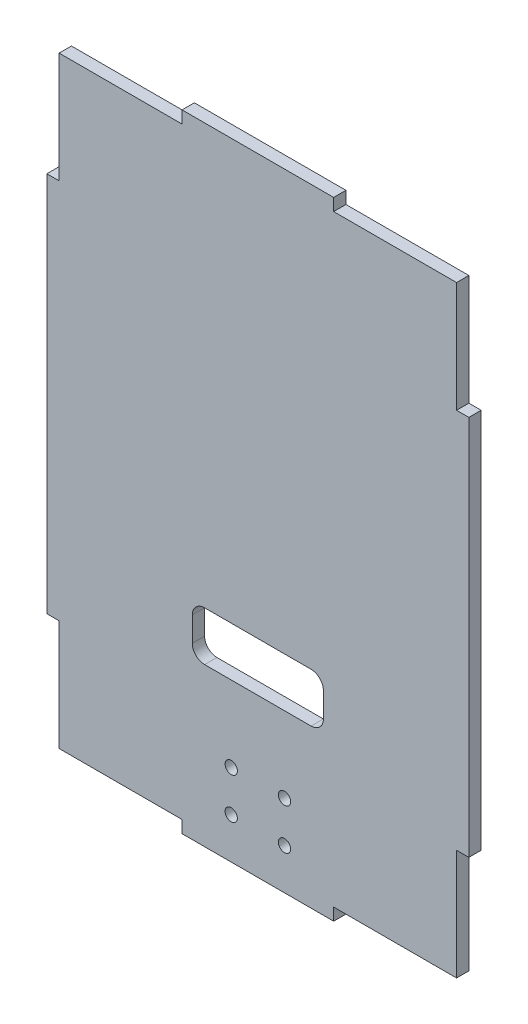
ISO-10303-21;
HEADER;
FILE_DESCRIPTION(('STEP AP214'),'2;1');
FILE_NAME('part.step','',(''),(''),'','','');
FILE_SCHEMA(('AUTOMOTIVE_DESIGN { 1 0 10303 214 1 1 1 1 }'));
ENDSEC;
DATA;
#1=APPLICATION_CONTEXT('core data for automotive mechanical design processes');
#2=APPLICATION_PROTOCOL_DEFINITION('international standard','automotive_design',2000,#1);
#3=PRODUCT_CONTEXT('',#1,'mechanical');
#4=PRODUCT('Part','Part','',(#3));
#5=PRODUCT_RELATED_PRODUCT_CATEGORY('part','',(#4));
#6=PRODUCT_DEFINITION_FORMATION('','',#4);
#7=PRODUCT_DEFINITION_CONTEXT('part definition',#1,'design');
#8=PRODUCT_DEFINITION('design','',#6,#7);
#9=PRODUCT_DEFINITION_SHAPE('','',#8);
#10=(LENGTH_UNIT() NAMED_UNIT(*) SI_UNIT(.MILLI.,.METRE.));
#11=(NAMED_UNIT(*) PLANE_ANGLE_UNIT() SI_UNIT($,.RADIAN.));
#12=(NAMED_UNIT(*) SI_UNIT($,.STERADIAN.) SOLID_ANGLE_UNIT());
#13=UNCERTAINTY_MEASURE_WITH_UNIT(LENGTH_MEASURE(1.E-05),#10,'distance_accuracy_value','');
#14=(GEOMETRIC_REPRESENTATION_CONTEXT(3) GLOBAL_UNCERTAINTY_ASSIGNED_CONTEXT((#13)) GLOBAL_UNIT_ASSIGNED_CONTEXT((#10,
#11,#12)) REPRESENTATION_CONTEXT('',''));
#15=CARTESIAN_POINT('',(0.,0.,0.));
#16=DIRECTION('',(0.,0.,1.));
#17=DIRECTION('',(1.,0.,0.));
#18=AXIS2_PLACEMENT_3D('',#15,#16,#17);
#19=CARTESIAN_POINT('',(51.5,-76.5,3.));
#20=DIRECTION('',(-1.,0.,0.));
#21=DIRECTION('',(0.,0.,1.));
#22=AXIS2_PLACEMENT_3D('',#19,#20,#21);
#23=PLANE('',#22);
#24=DIRECTION('',(0.,1.,0.));
#25=VECTOR('',#24,1.);
#26=CARTESIAN_POINT('',(51.5,-76.5,3.));
#27=LINE('',#26,#25);
#28=CARTESIAN_POINT('',(51.5,-46.5,3.));
#29=VERTEX_POINT('',#28);
#30=CARTESIAN_POINT('',(51.5,46.5,3.));
#31=VERTEX_POINT('',#30);
#32=EDGE_CURVE('E319',#29,#31,#27,.T.);
#33=ORIENTED_EDGE('',*,*,#32,.F.);
#34=DIRECTION('',(0.,0.,-1.));
#35=VECTOR('',#34,1.);
#36=CARTESIAN_POINT('',(51.5,-46.5,3.));
#37=LINE('',#36,#35);
#38=CARTESIAN_POINT('',(51.5,-46.5,0.));
#39=VERTEX_POINT('',#38);
#40=EDGE_CURVE('E234',#29,#39,#37,.T.);
#41=ORIENTED_EDGE('',*,*,#40,.T.);
#42=DIRECTION('',(0.,1.,0.));
#43=VECTOR('',#42,1.);
#44=CARTESIAN_POINT('',(51.5,-76.5,0.));
#45=LINE('',#44,#43);
#46=CARTESIAN_POINT('',(51.5,46.5,0.));
#47=VERTEX_POINT('',#46);
#48=EDGE_CURVE('E308',#39,#47,#45,.T.);
#49=ORIENTED_EDGE('',*,*,#48,.T.);
#50=DIRECTION('',(0.,0.,-1.));
#51=VECTOR('',#50,1.);
#52=CARTESIAN_POINT('',(51.5,46.5,3.));
#53=LINE('',#52,#51);
#54=EDGE_CURVE('E566',#31,#47,#53,.T.);
#55=ORIENTED_EDGE('',*,*,#54,.F.);
#56=EDGE_LOOP('',(#33,#41,#49,#55));
#57=FACE_BOUND('',#56,.T.);
#58=ADVANCED_FACE('F39',(#57),#23,.F.);
#59=CARTESIAN_POINT('',(-51.5,-76.5,3.));
#60=DIRECTION('',(1.,0.,0.));
#61=DIRECTION('',(0.,0.,-1.));
#62=AXIS2_PLACEMENT_3D('',#59,#60,#61);
#63=PLANE('',#62);
#64=DIRECTION('',(0.,-1.,0.));
#65=VECTOR('',#64,1.);
#66=CARTESIAN_POINT('',(-51.5,-76.5,3.));
#67=LINE('',#66,#65);
#68=CARTESIAN_POINT('',(-51.5,46.5,3.));
#69=VERTEX_POINT('',#68);
#70=CARTESIAN_POINT('',(-51.5,-46.5,3.));
#71=VERTEX_POINT('',#70);
#72=EDGE_CURVE('E326',#69,#71,#67,.T.);
#73=ORIENTED_EDGE('',*,*,#72,.F.);
#74=DIRECTION('',(0.,0.,-1.));
#75=VECTOR('',#74,1.);
#76=CARTESIAN_POINT('',(-51.5,46.5,3.));
#77=LINE('',#76,#75);
#78=CARTESIAN_POINT('',(-51.5,46.5,0.));
#79=VERTEX_POINT('',#78);
#80=EDGE_CURVE('E581',#69,#79,#77,.T.);
#81=ORIENTED_EDGE('',*,*,#80,.T.);
#82=DIRECTION('',(0.,-1.,0.));
#83=VECTOR('',#82,1.);
#84=CARTESIAN_POINT('',(-51.5,-76.5,0.));
#85=LINE('',#84,#83);
#86=CARTESIAN_POINT('',(-51.5,-46.5,0.));
#87=VERTEX_POINT('',#86);
#88=EDGE_CURVE('E338',#79,#87,#85,.T.);
#89=ORIENTED_EDGE('',*,*,#88,.T.);
#90=DIRECTION('',(0.,0.,-1.));
#91=VECTOR('',#90,1.);
#92=CARTESIAN_POINT('',(-51.5,-46.5,3.));
#93=LINE('',#92,#91);
#94=EDGE_CURVE('E606',#71,#87,#93,.T.);
#95=ORIENTED_EDGE('',*,*,#94,.F.);
#96=EDGE_LOOP('',(#73,#81,#89,#95));
#97=FACE_BOUND('',#96,.T.);
#98=ADVANCED_FACE('F420',(#97),#63,.F.);
#99=CARTESIAN_POINT('',(0.,0.,3.));
#100=DIRECTION('',(0.,0.,-1.));
#101=DIRECTION('',(-1.,0.,0.));
#102=AXIS2_PLACEMENT_3D('',#99,#100,#101);
#103=PLANE('',#102);
#104=CARTESIAN_POINT('',(6.5,-66.5,3.));
#105=DIRECTION('',(0.,0.,-1.));
#106=DIRECTION('',(-1.,0.,0.));
#107=AXIS2_PLACEMENT_3D('',#104,#105,#106);
#108=CIRCLE('',#107,1.5);
#109=CARTESIAN_POINT('',(5.,-66.5,3.));
#110=VERTEX_POINT('',#109);
#111=EDGE_CURVE('E535',#110,#110,#108,.T.);
#112=ORIENTED_EDGE('',*,*,#111,.T.);
#113=EDGE_LOOP('',(#112));
#114=FACE_BOUND('',#113,.T.);
#115=CARTESIAN_POINT('',(-6.5,-66.5,3.));
#116=DIRECTION('',(0.,0.,-1.));
#117=DIRECTION('',(-1.,0.,0.));
#118=AXIS2_PLACEMENT_3D('',#115,#116,#117);
#119=CIRCLE('',#118,1.5);
#120=CARTESIAN_POINT('',(-8.,-66.5,3.));
#121=VERTEX_POINT('',#120);
#122=EDGE_CURVE('E530',#121,#121,#119,.T.);
#123=ORIENTED_EDGE('',*,*,#122,.T.);
#124=EDGE_LOOP('',(#123));
#125=FACE_BOUND('',#124,.T.);
#126=CARTESIAN_POINT('',(-6.5,-56.5,3.));
#127=DIRECTION('',(0.,0.,-1.));
#128=DIRECTION('',(-1.,0.,0.));
#129=AXIS2_PLACEMENT_3D('',#126,#127,#128);
#130=CIRCLE('',#129,1.5);
#131=CARTESIAN_POINT('',(-8.,-56.5,3.));
#132=VERTEX_POINT('',#131);
#133=EDGE_CURVE('E545',#132,#132,#130,.T.);
#134=ORIENTED_EDGE('',*,*,#133,.T.);
#135=EDGE_LOOP('',(#134));
#136=FACE_BOUND('',#135,.T.);
#137=CARTESIAN_POINT('',(6.5,-56.5,3.));
#138=DIRECTION('',(0.,0.,-1.));
#139=DIRECTION('',(-1.,0.,0.));
#140=AXIS2_PLACEMENT_3D('',#137,#138,#139);
#141=CIRCLE('',#140,1.5);
#142=CARTESIAN_POINT('',(5.,-56.5,3.));
#143=VERTEX_POINT('',#142);
#144=EDGE_CURVE('E551',#143,#143,#141,.T.);
#145=ORIENTED_EDGE('',*,*,#144,.T.);
#146=EDGE_LOOP('',(#145));
#147=FACE_BOUND('',#146,.T.);
#148=DIRECTION('',(-1.,0.,0.));
#149=VECTOR('',#148,1.);
#150=CARTESIAN_POINT('',(-16.,-26.,3.));
#151=LINE('',#150,#149);
#152=CARTESIAN_POINT('',(13.,-26.,3.));
#153=VERTEX_POINT('',#152);
#154=CARTESIAN_POINT('',(-13.,-26.,3.));
#155=VERTEX_POINT('',#154);
#156=EDGE_CURVE('E311',#153,#155,#151,.T.);
#157=ORIENTED_EDGE('',*,*,#156,.F.);
#158=CARTESIAN_POINT('',(13.,-29.,3.));
#159=DIRECTION('',(0.,0.,-1.));
#160=DIRECTION('',(-1.,0.,0.));
#161=AXIS2_PLACEMENT_3D('',#158,#159,#160);
#162=CIRCLE('',#161,3.);
#163=CARTESIAN_POINT('',(16.,-29.,3.));
#164=VERTEX_POINT('',#163);
#165=EDGE_CURVE('E366',#153,#164,#162,.T.);
#166=ORIENTED_EDGE('',*,*,#165,.T.);
#167=DIRECTION('',(0.,1.,0.));
#168=VECTOR('',#167,1.);
#169=CARTESIAN_POINT('',(16.,-38.,3.));
#170=LINE('',#169,#168);
#171=CARTESIAN_POINT('',(16.,-35.,3.));
#172=VERTEX_POINT('',#171);
#173=EDGE_CURVE('E292',#172,#164,#170,.T.);
#174=ORIENTED_EDGE('',*,*,#173,.F.);
#175=CARTESIAN_POINT('',(13.,-35.,3.));
#176=DIRECTION('',(0.,0.,-1.));
#177=DIRECTION('',(-1.,0.,0.));
#178=AXIS2_PLACEMENT_3D('',#175,#176,#177);
#179=CIRCLE('',#178,3.);
#180=CARTESIAN_POINT('',(13.,-38.,3.));
#181=VERTEX_POINT('',#180);
#182=EDGE_CURVE('E362',#172,#181,#179,.T.);
#183=ORIENTED_EDGE('',*,*,#182,.T.);
#184=DIRECTION('',(1.,0.,0.));
#185=VECTOR('',#184,1.);
#186=CARTESIAN_POINT('',(-16.,-38.,3.));
#187=LINE('',#186,#185);
#188=CARTESIAN_POINT('',(-13.,-38.,3.));
#189=VERTEX_POINT('',#188);
#190=EDGE_CURVE('E299',#189,#181,#187,.T.);
#191=ORIENTED_EDGE('',*,*,#190,.F.);
#192=CARTESIAN_POINT('',(-13.,-35.,3.));
#193=DIRECTION('',(0.,0.,-1.));
#194=DIRECTION('',(-1.,0.,0.));
#195=AXIS2_PLACEMENT_3D('',#192,#193,#194);
#196=CIRCLE('',#195,3.);
#197=CARTESIAN_POINT('',(-16.,-35.,3.));
#198=VERTEX_POINT('',#197);
#199=EDGE_CURVE('E370',#189,#198,#196,.T.);
#200=ORIENTED_EDGE('',*,*,#199,.T.);
#201=DIRECTION('',(0.,-1.,0.));
#202=VECTOR('',#201,1.);
#203=CARTESIAN_POINT('',(-16.,-38.,3.));
#204=LINE('',#203,#202);
#205=CARTESIAN_POINT('',(-16.,-29.,3.));
#206=VERTEX_POINT('',#205);
#207=EDGE_CURVE('E314',#206,#198,#204,.T.);
#208=ORIENTED_EDGE('',*,*,#207,.F.);
#209=CARTESIAN_POINT('',(-13.,-29.,3.));
#210=DIRECTION('',(0.,0.,-1.));
#211=DIRECTION('',(-1.,0.,0.));
#212=AXIS2_PLACEMENT_3D('',#209,#210,#211);
#213=CIRCLE('',#212,3.);
#214=EDGE_CURVE('E47',#206,#155,#213,.T.);
#215=ORIENTED_EDGE('',*,*,#214,.T.);
#216=EDGE_LOOP('',(#157,#166,#174,#183,#191,#200,#208,#215));
#217=FACE_BOUND('',#216,.T.);
#218=DIRECTION('',(0.,-1.,0.));
#219=VECTOR('',#218,1.);
#220=CARTESIAN_POINT('',(48.5,0.,3.));
#221=LINE('',#220,#219);
#222=CARTESIAN_POINT('',(48.5,-46.5,3.));
#223=VERTEX_POINT('',#222);
#224=CARTESIAN_POINT('',(48.5,-73.5,3.));
#225=VERTEX_POINT('',#224);
#226=EDGE_CURVE('E230',#223,#225,#221,.T.);
#227=ORIENTED_EDGE('',*,*,#226,.F.);
#228=DIRECTION('',(1.,0.,0.));
#229=VECTOR('',#228,1.);
#230=CARTESIAN_POINT('',(0.,-46.5,3.));
#231=LINE('',#230,#229);
#232=EDGE_CURVE('E556',#223,#29,#231,.T.);
#233=ORIENTED_EDGE('',*,*,#232,.T.);
#234=ORIENTED_EDGE('',*,*,#32,.T.);
#235=DIRECTION('',(1.,0.,0.));
#236=VECTOR('',#235,1.);
#237=CARTESIAN_POINT('',(0.,46.5,3.));
#238=LINE('',#237,#236);
#239=CARTESIAN_POINT('',(48.5,46.5,3.));
#240=VERTEX_POINT('',#239);
#241=EDGE_CURVE('E565',#240,#31,#238,.T.);
#242=ORIENTED_EDGE('',*,*,#241,.F.);
#243=DIRECTION('',(0.,-1.,0.));
#244=VECTOR('',#243,1.);
#245=CARTESIAN_POINT('',(48.5,0.,3.));
#246=LINE('',#245,#244);
#247=CARTESIAN_POINT('',(48.5,73.5,3.));
#248=VERTEX_POINT('',#247);
#249=EDGE_CURVE('E574',#248,#240,#246,.T.);
#250=ORIENTED_EDGE('',*,*,#249,.F.);
#251=DIRECTION('',(-1.,0.,0.));
#252=VECTOR('',#251,1.);
#253=CARTESIAN_POINT('',(0.,73.5,3.));
#254=LINE('',#253,#252);
#255=CARTESIAN_POINT('',(18.5,73.5,3.));
#256=VERTEX_POINT('',#255);
#257=EDGE_CURVE('E612',#248,#256,#254,.T.);
#258=ORIENTED_EDGE('',*,*,#257,.T.);
#259=DIRECTION('',(0.,1.,0.));
#260=VECTOR('',#259,1.);
#261=CARTESIAN_POINT('',(18.5,0.,3.));
#262=LINE('',#261,#260);
#263=CARTESIAN_POINT('',(18.5,76.5,3.));
#264=VERTEX_POINT('',#263);
#265=EDGE_CURVE('E614',#256,#264,#262,.T.);
#266=ORIENTED_EDGE('',*,*,#265,.T.);
#267=DIRECTION('',(-1.,0.,0.));
#268=VECTOR('',#267,1.);
#269=CARTESIAN_POINT('',(-51.5,76.5,3.));
#270=LINE('',#269,#268);
#271=CARTESIAN_POINT('',(-18.5,76.5,3.));
#272=VERTEX_POINT('',#271);
#273=EDGE_CURVE('E322',#264,#272,#270,.T.);
#274=ORIENTED_EDGE('',*,*,#273,.T.);
#275=DIRECTION('',(0.,1.,0.));
#276=VECTOR('',#275,1.);
#277=CARTESIAN_POINT('',(-18.5,0.,3.));
#278=LINE('',#277,#276);
#279=CARTESIAN_POINT('',(-18.5,73.5,3.));
#280=VERTEX_POINT('',#279);
#281=EDGE_CURVE('E262',#280,#272,#278,.T.);
#282=ORIENTED_EDGE('',*,*,#281,.F.);
#283=DIRECTION('',(-1.,0.,0.));
#284=VECTOR('',#283,1.);
#285=CARTESIAN_POINT('',(0.,73.5,3.));
#286=LINE('',#285,#284);
#287=CARTESIAN_POINT('',(-48.5,73.5,3.));
#288=VERTEX_POINT('',#287);
#289=EDGE_CURVE('E264',#280,#288,#286,.T.);
#290=ORIENTED_EDGE('',*,*,#289,.T.);
#291=DIRECTION('',(0.,-1.,0.));
#292=VECTOR('',#291,1.);
#293=CARTESIAN_POINT('',(-48.5,0.,3.));
#294=LINE('',#293,#292);
#295=CARTESIAN_POINT('',(-48.5,46.5,3.));
#296=VERTEX_POINT('',#295);
#297=EDGE_CURVE('E588',#288,#296,#294,.T.);
#298=ORIENTED_EDGE('',*,*,#297,.T.);
#299=DIRECTION('',(-1.,0.,0.));
#300=VECTOR('',#299,1.);
#301=CARTESIAN_POINT('',(0.,46.5,3.));
#302=LINE('',#301,#300);
#303=EDGE_CURVE('E580',#296,#69,#302,.T.);
#304=ORIENTED_EDGE('',*,*,#303,.T.);
#305=ORIENTED_EDGE('',*,*,#72,.T.);
#306=DIRECTION('',(-1.,0.,0.));
#307=VECTOR('',#306,1.);
#308=CARTESIAN_POINT('',(0.,-46.5,3.));
#309=LINE('',#308,#307);
#310=CARTESIAN_POINT('',(-48.5,-46.5,3.));
#311=VERTEX_POINT('',#310);
#312=EDGE_CURVE('E597',#311,#71,#309,.T.);
#313=ORIENTED_EDGE('',*,*,#312,.F.);
#314=DIRECTION('',(0.,-1.,0.));
#315=VECTOR('',#314,1.);
#316=CARTESIAN_POINT('',(-48.5,0.,3.));
#317=LINE('',#316,#315);
#318=CARTESIAN_POINT('',(-48.5,-73.5,3.));
#319=VERTEX_POINT('',#318);
#320=EDGE_CURVE('E599',#311,#319,#317,.T.);
#321=ORIENTED_EDGE('',*,*,#320,.T.);
#322=DIRECTION('',(-1.,0.,0.));
#323=VECTOR('',#322,1.);
#324=CARTESIAN_POINT('',(0.,-73.5,3.));
#325=LINE('',#324,#323);
#326=CARTESIAN_POINT('',(-18.5,-73.5,3.));
#327=VERTEX_POINT('',#326);
#328=EDGE_CURVE('E278',#327,#319,#325,.T.);
#329=ORIENTED_EDGE('',*,*,#328,.F.);
#330=DIRECTION('',(0.,-1.,0.));
#331=VECTOR('',#330,1.);
#332=CARTESIAN_POINT('',(-18.5,0.,3.));
#333=LINE('',#332,#331);
#334=CARTESIAN_POINT('',(-18.5,-76.5,3.));
#335=VERTEX_POINT('',#334);
#336=EDGE_CURVE('E281',#327,#335,#333,.T.);
#337=ORIENTED_EDGE('',*,*,#336,.T.);
#338=DIRECTION('',(1.,0.,0.));
#339=VECTOR('',#338,1.);
#340=CARTESIAN_POINT('',(-51.5,-76.5,3.));
#341=LINE('',#340,#339);
#342=CARTESIAN_POINT('',(18.5,-76.5,3.));
#343=VERTEX_POINT('',#342);
#344=EDGE_CURVE('E329',#335,#343,#341,.T.);
#345=ORIENTED_EDGE('',*,*,#344,.T.);
#346=DIRECTION('',(0.,-1.,0.));
#347=VECTOR('',#346,1.);
#348=CARTESIAN_POINT('',(18.5,0.,3.));
#349=LINE('',#348,#347);
#350=CARTESIAN_POINT('',(18.5,-73.5,3.));
#351=VERTEX_POINT('',#350);
#352=EDGE_CURVE('E249',#351,#343,#349,.T.);
#353=ORIENTED_EDGE('',*,*,#352,.F.);
#354=DIRECTION('',(-1.,0.,0.));
#355=VECTOR('',#354,1.);
#356=CARTESIAN_POINT('',(0.,-73.5,3.));
#357=LINE('',#356,#355);
#358=EDGE_CURVE('E252',#225,#351,#357,.T.);
#359=ORIENTED_EDGE('',*,*,#358,.F.);
#360=EDGE_LOOP('',(#227,#233,#234,#242,#250,#258,#266,#274,#282,#290,#298,#304,#305,#313,#321,
#329,#337,#345,#353,#359));
#361=FACE_BOUND('',#360,.T.);
#362=ADVANCED_FACE('F376',(#114,#125,#136,#147,#217,#361),#103,.F.);
#363=CARTESIAN_POINT('',(0.,0.,0.));
#364=DIRECTION('',(0.,0.,-1.));
#365=DIRECTION('',(-1.,0.,0.));
#366=AXIS2_PLACEMENT_3D('',#363,#364,#365);
#367=PLANE('',#366);
#368=CARTESIAN_POINT('',(6.5,-66.5,0.));
#369=DIRECTION('',(0.,0.,-1.));
#370=DIRECTION('',(-1.,0.,0.));
#371=AXIS2_PLACEMENT_3D('',#368,#369,#370);
#372=CIRCLE('',#371,1.5);
#373=CARTESIAN_POINT('',(5.,-66.5,0.));
#374=VERTEX_POINT('',#373);
#375=EDGE_CURVE('E538',#374,#374,#372,.T.);
#376=ORIENTED_EDGE('',*,*,#375,.F.);
#377=EDGE_LOOP('',(#376));
#378=FACE_BOUND('',#377,.T.);
#379=CARTESIAN_POINT('',(-6.5,-66.5,0.));
#380=DIRECTION('',(0.,0.,-1.));
#381=DIRECTION('',(-1.,0.,0.));
#382=AXIS2_PLACEMENT_3D('',#379,#380,#381);
#383=CIRCLE('',#382,1.5);
#384=CARTESIAN_POINT('',(-8.,-66.5,0.));
#385=VERTEX_POINT('',#384);
#386=EDGE_CURVE('E533',#385,#385,#383,.T.);
#387=ORIENTED_EDGE('',*,*,#386,.F.);
#388=EDGE_LOOP('',(#387));
#389=FACE_BOUND('',#388,.T.);
#390=CARTESIAN_POINT('',(-6.5,-56.5,0.));
#391=DIRECTION('',(0.,0.,-1.));
#392=DIRECTION('',(-1.,0.,0.));
#393=AXIS2_PLACEMENT_3D('',#390,#391,#392);
#394=CIRCLE('',#393,1.5);
#395=CARTESIAN_POINT('',(-8.,-56.5,0.));
#396=VERTEX_POINT('',#395);
#397=EDGE_CURVE('E540',#396,#396,#394,.T.);
#398=ORIENTED_EDGE('',*,*,#397,.F.);
#399=EDGE_LOOP('',(#398));
#400=FACE_BOUND('',#399,.T.);
#401=CARTESIAN_POINT('',(6.5,-56.5,0.));
#402=DIRECTION('',(0.,0.,-1.));
#403=DIRECTION('',(-1.,0.,0.));
#404=AXIS2_PLACEMENT_3D('',#401,#402,#403);
#405=CIRCLE('',#404,1.5);
#406=CARTESIAN_POINT('',(5.,-56.5,0.));
#407=VERTEX_POINT('',#406);
#408=EDGE_CURVE('E548',#407,#407,#405,.T.);
#409=ORIENTED_EDGE('',*,*,#408,.F.);
#410=EDGE_LOOP('',(#409));
#411=FACE_BOUND('',#410,.T.);
#412=DIRECTION('',(1.,0.,0.));
#413=VECTOR('',#412,1.);
#414=CARTESIAN_POINT('',(-16.,-38.,0.));
#415=LINE('',#414,#413);
#416=CARTESIAN_POINT('',(-13.,-38.,0.));
#417=VERTEX_POINT('',#416);
#418=CARTESIAN_POINT('',(13.,-38.,0.));
#419=VERTEX_POINT('',#418);
#420=EDGE_CURVE('E305',#417,#419,#415,.T.);
#421=ORIENTED_EDGE('',*,*,#420,.T.);
#422=CARTESIAN_POINT('',(13.,-35.,0.));
#423=DIRECTION('',(0.,0.,-1.));
#424=DIRECTION('',(-1.,0.,0.));
#425=AXIS2_PLACEMENT_3D('',#422,#423,#424);
#426=CIRCLE('',#425,3.);
#427=CARTESIAN_POINT('',(16.,-35.,0.));
#428=VERTEX_POINT('',#427);
#429=EDGE_CURVE('E364',#419,#428,#426,.F.);
#430=ORIENTED_EDGE('',*,*,#429,.T.);
#431=DIRECTION('',(0.,1.,0.));
#432=VECTOR('',#431,1.);
#433=CARTESIAN_POINT('',(16.,-38.,0.));
#434=LINE('',#433,#432);
#435=CARTESIAN_POINT('',(16.,-29.,0.));
#436=VERTEX_POINT('',#435);
#437=EDGE_CURVE('E295',#428,#436,#434,.T.);
#438=ORIENTED_EDGE('',*,*,#437,.T.);
#439=CARTESIAN_POINT('',(13.,-29.,0.));
#440=DIRECTION('',(0.,0.,-1.));
#441=DIRECTION('',(-1.,0.,0.));
#442=AXIS2_PLACEMENT_3D('',#439,#440,#441);
#443=CIRCLE('',#442,3.);
#444=CARTESIAN_POINT('',(13.,-26.,0.));
#445=VERTEX_POINT('',#444);
#446=EDGE_CURVE('E368',#436,#445,#443,.F.);
#447=ORIENTED_EDGE('',*,*,#446,.T.);
#448=DIRECTION('',(-1.,0.,0.));
#449=VECTOR('',#448,1.);
#450=CARTESIAN_POINT('',(-16.,-26.,0.));
#451=LINE('',#450,#449);
#452=CARTESIAN_POINT('',(-13.,-26.,0.));
#453=VERTEX_POINT('',#452);
#454=EDGE_CURVE('E298',#445,#453,#451,.T.);
#455=ORIENTED_EDGE('',*,*,#454,.T.);
#456=CARTESIAN_POINT('',(-13.,-29.,0.));
#457=DIRECTION('',(0.,0.,-1.));
#458=DIRECTION('',(-1.,0.,0.));
#459=AXIS2_PLACEMENT_3D('',#456,#457,#458);
#460=CIRCLE('',#459,3.);
#461=CARTESIAN_POINT('',(-16.,-29.,0.));
#462=VERTEX_POINT('',#461);
#463=EDGE_CURVE('E11',#453,#462,#460,.F.);
#464=ORIENTED_EDGE('',*,*,#463,.T.);
#465=DIRECTION('',(0.,-1.,0.));
#466=VECTOR('',#465,1.);
#467=CARTESIAN_POINT('',(-16.,-38.,0.));
#468=LINE('',#467,#466);
#469=CARTESIAN_POINT('',(-16.,-35.,0.));
#470=VERTEX_POINT('',#469);
#471=EDGE_CURVE('E302',#462,#470,#468,.T.);
#472=ORIENTED_EDGE('',*,*,#471,.T.);
#473=CARTESIAN_POINT('',(-13.,-35.,0.));
#474=DIRECTION('',(0.,0.,-1.));
#475=DIRECTION('',(-1.,0.,0.));
#476=AXIS2_PLACEMENT_3D('',#473,#474,#475);
#477=CIRCLE('',#476,3.);
#478=EDGE_CURVE('E372',#470,#417,#477,.F.);
#479=ORIENTED_EDGE('',*,*,#478,.T.);
#480=EDGE_LOOP('',(#421,#430,#438,#447,#455,#464,#472,#479));
#481=FACE_BOUND('',#480,.T.);
#482=DIRECTION('',(1.,0.,0.));
#483=VECTOR('',#482,1.);
#484=CARTESIAN_POINT('',(0.,-46.5,0.));
#485=LINE('',#484,#483);
#486=CARTESIAN_POINT('',(48.5,-46.5,0.));
#487=VERTEX_POINT('',#486);
#488=EDGE_CURVE('E242',#487,#39,#485,.T.);
#489=ORIENTED_EDGE('',*,*,#488,.F.);
#490=DIRECTION('',(0.,-1.,0.));
#491=VECTOR('',#490,1.);
#492=CARTESIAN_POINT('',(48.5,0.,0.));
#493=LINE('',#492,#491);
#494=CARTESIAN_POINT('',(48.5,-73.5,0.));
#495=VERTEX_POINT('',#494);
#496=EDGE_CURVE('E227',#487,#495,#493,.T.);
#497=ORIENTED_EDGE('',*,*,#496,.T.);
#498=DIRECTION('',(-1.,0.,0.));
#499=VECTOR('',#498,1.);
#500=CARTESIAN_POINT('',(0.,-73.5,0.));
#501=LINE('',#500,#499);
#502=CARTESIAN_POINT('',(18.5,-73.5,0.));
#503=VERTEX_POINT('',#502);
#504=EDGE_CURVE('E239',#495,#503,#501,.T.);
#505=ORIENTED_EDGE('',*,*,#504,.T.);
#506=DIRECTION('',(0.,-1.,0.));
#507=VECTOR('',#506,1.);
#508=CARTESIAN_POINT('',(18.5,0.,0.));
#509=LINE('',#508,#507);
#510=CARTESIAN_POINT('',(18.5,-76.5,0.));
#511=VERTEX_POINT('',#510);
#512=EDGE_CURVE('E250',#503,#511,#509,.T.);
#513=ORIENTED_EDGE('',*,*,#512,.T.);
#514=DIRECTION('',(1.,0.,0.));
#515=VECTOR('',#514,1.);
#516=CARTESIAN_POINT('',(-51.5,-76.5,0.));
#517=LINE('',#516,#515);
#518=CARTESIAN_POINT('',(-18.5,-76.5,0.));
#519=VERTEX_POINT('',#518);
#520=EDGE_CURVE('E323',#519,#511,#517,.T.);
#521=ORIENTED_EDGE('',*,*,#520,.F.);
#522=DIRECTION('',(0.,-1.,0.));
#523=VECTOR('',#522,1.);
#524=CARTESIAN_POINT('',(-18.5,0.,0.));
#525=LINE('',#524,#523);
#526=CARTESIAN_POINT('',(-18.5,-73.5,0.));
#527=VERTEX_POINT('',#526);
#528=EDGE_CURVE('E282',#527,#519,#525,.T.);
#529=ORIENTED_EDGE('',*,*,#528,.F.);
#530=DIRECTION('',(-1.,0.,0.));
#531=VECTOR('',#530,1.);
#532=CARTESIAN_POINT('',(0.,-73.5,0.));
#533=LINE('',#532,#531);
#534=CARTESIAN_POINT('',(-48.5,-73.5,0.));
#535=VERTEX_POINT('',#534);
#536=EDGE_CURVE('E260',#527,#535,#533,.T.);
#537=ORIENTED_EDGE('',*,*,#536,.T.);
#538=DIRECTION('',(0.,-1.,0.));
#539=VECTOR('',#538,1.);
#540=CARTESIAN_POINT('',(-48.5,0.,0.));
#541=LINE('',#540,#539);
#542=CARTESIAN_POINT('',(-48.5,-46.5,0.));
#543=VERTEX_POINT('',#542);
#544=EDGE_CURVE('E54',#543,#535,#541,.T.);
#545=ORIENTED_EDGE('',*,*,#544,.F.);
#546=DIRECTION('',(-1.,0.,0.));
#547=VECTOR('',#546,1.);
#548=CARTESIAN_POINT('',(0.,-46.5,0.));
#549=LINE('',#548,#547);
#550=EDGE_CURVE('E243',#543,#87,#549,.T.);
#551=ORIENTED_EDGE('',*,*,#550,.T.);
#552=ORIENTED_EDGE('',*,*,#88,.F.);
#553=DIRECTION('',(-1.,0.,0.));
#554=VECTOR('',#553,1.);
#555=CARTESIAN_POINT('',(0.,46.5,0.));
#556=LINE('',#555,#554);
#557=CARTESIAN_POINT('',(-48.5,46.5,0.));
#558=VERTEX_POINT('',#557);
#559=EDGE_CURVE('E586',#558,#79,#556,.T.);
#560=ORIENTED_EDGE('',*,*,#559,.F.);
#561=DIRECTION('',(0.,-1.,0.));
#562=VECTOR('',#561,1.);
#563=CARTESIAN_POINT('',(-48.5,0.,0.));
#564=LINE('',#563,#562);
#565=CARTESIAN_POINT('',(-48.5,73.5,0.));
#566=VERTEX_POINT('',#565);
#567=EDGE_CURVE('E570',#566,#558,#564,.T.);
#568=ORIENTED_EDGE('',*,*,#567,.F.);
#569=DIRECTION('',(-1.,0.,0.));
#570=VECTOR('',#569,1.);
#571=CARTESIAN_POINT('',(0.,73.5,0.));
#572=LINE('',#571,#570);
#573=CARTESIAN_POINT('',(-18.5,73.5,0.));
#574=VERTEX_POINT('',#573);
#575=EDGE_CURVE('E265',#574,#566,#572,.T.);
#576=ORIENTED_EDGE('',*,*,#575,.F.);
#577=DIRECTION('',(0.,1.,0.));
#578=VECTOR('',#577,1.);
#579=CARTESIAN_POINT('',(-18.5,0.,0.));
#580=LINE('',#579,#578);
#581=CARTESIAN_POINT('',(-18.5,76.5,0.));
#582=VERTEX_POINT('',#581);
#583=EDGE_CURVE('E269',#574,#582,#580,.T.);
#584=ORIENTED_EDGE('',*,*,#583,.T.);
#585=DIRECTION('',(-1.,0.,0.));
#586=VECTOR('',#585,1.);
#587=CARTESIAN_POINT('',(-51.5,76.5,0.));
#588=LINE('',#587,#586);
#589=CARTESIAN_POINT('',(18.5,76.5,0.));
#590=VERTEX_POINT('',#589);
#591=EDGE_CURVE('E335',#590,#582,#588,.T.);
#592=ORIENTED_EDGE('',*,*,#591,.F.);
#593=DIRECTION('',(0.,1.,0.));
#594=VECTOR('',#593,1.);
#595=CARTESIAN_POINT('',(18.5,0.,0.));
#596=LINE('',#595,#594);
#597=CARTESIAN_POINT('',(18.5,73.5,0.));
#598=VERTEX_POINT('',#597);
#599=EDGE_CURVE('E615',#598,#590,#596,.T.);
#600=ORIENTED_EDGE('',*,*,#599,.F.);
#601=DIRECTION('',(-1.,0.,0.));
#602=VECTOR('',#601,1.);
#603=CARTESIAN_POINT('',(0.,73.5,0.));
#604=LINE('',#603,#602);
#605=CARTESIAN_POINT('',(48.5,73.5,0.));
#606=VERTEX_POINT('',#605);
#607=EDGE_CURVE('E608',#606,#598,#604,.T.);
#608=ORIENTED_EDGE('',*,*,#607,.F.);
#609=DIRECTION('',(0.,-1.,0.));
#610=VECTOR('',#609,1.);
#611=CARTESIAN_POINT('',(48.5,0.,0.));
#612=LINE('',#611,#610);
#613=CARTESIAN_POINT('',(48.5,46.5,0.));
#614=VERTEX_POINT('',#613);
#615=EDGE_CURVE('E62',#606,#614,#612,.T.);
#616=ORIENTED_EDGE('',*,*,#615,.T.);
#617=DIRECTION('',(1.,0.,0.));
#618=VECTOR('',#617,1.);
#619=CARTESIAN_POINT('',(0.,46.5,0.));
#620=LINE('',#619,#618);
#621=EDGE_CURVE('E571',#614,#47,#620,.T.);
#622=ORIENTED_EDGE('',*,*,#621,.T.);
#623=ORIENTED_EDGE('',*,*,#48,.F.);
#624=EDGE_LOOP('',(#489,#497,#505,#513,#521,#529,#537,#545,#551,#552,#560,#568,#576,#584,#592,
#600,#608,#616,#622,#623));
#625=FACE_BOUND('',#624,.T.);
#626=ADVANCED_FACE('F237',(#378,#389,#400,#411,#481,#625),#367,.T.);
#627=CARTESIAN_POINT('',(0.,73.5,3.));
#628=DIRECTION('',(0.,-1.,0.));
#629=DIRECTION('',(0.,0.,-1.));
#630=AXIS2_PLACEMENT_3D('',#627,#628,#629);
#631=PLANE('',#630);
#632=DIRECTION('',(0.,0.,-1.));
#633=VECTOR('',#632,1.);
#634=CARTESIAN_POINT('',(48.5,73.5,3.));
#635=LINE('',#634,#633);
#636=EDGE_CURVE('E563',#248,#606,#635,.T.);
#637=ORIENTED_EDGE('',*,*,#636,.T.);
#638=ORIENTED_EDGE('',*,*,#607,.T.);
#639=DIRECTION('',(0.,0.,-1.));
#640=VECTOR('',#639,1.);
#641=CARTESIAN_POINT('',(18.5,73.5,3.));
#642=LINE('',#641,#640);
#643=EDGE_CURVE('E618',#256,#598,#642,.T.);
#644=ORIENTED_EDGE('',*,*,#643,.F.);
#645=ORIENTED_EDGE('',*,*,#257,.F.);
#646=EDGE_LOOP('',(#637,#638,#644,#645));
#647=FACE_BOUND('',#646,.T.);
#648=ADVANCED_FACE('F441',(#647),#631,.F.);
#649=CARTESIAN_POINT('',(0.,-73.5,3.));
#650=DIRECTION('',(0.,-1.,0.));
#651=DIRECTION('',(0.,0.,-1.));
#652=AXIS2_PLACEMENT_3D('',#649,#650,#651);
#653=PLANE('',#652);
#654=ORIENTED_EDGE('',*,*,#504,.F.);
#655=DIRECTION('',(0.,0.,-1.));
#656=VECTOR('',#655,1.);
#657=CARTESIAN_POINT('',(48.5,-73.5,3.));
#658=LINE('',#657,#656);
#659=EDGE_CURVE('E224',#225,#495,#658,.T.);
#660=ORIENTED_EDGE('',*,*,#659,.F.);
#661=ORIENTED_EDGE('',*,*,#358,.T.);
#662=DIRECTION('',(0.,0.,-1.));
#663=VECTOR('',#662,1.);
#664=CARTESIAN_POINT('',(18.5,-73.5,3.));
#665=LINE('',#664,#663);
#666=EDGE_CURVE('E248',#351,#503,#665,.T.);
#667=ORIENTED_EDGE('',*,*,#666,.T.);
#668=EDGE_LOOP('',(#654,#660,#661,#667));
#669=FACE_BOUND('',#668,.T.);
#670=ADVANCED_FACE('F246',(#669),#653,.T.);
#671=CARTESIAN_POINT('',(-51.5,76.5,3.));
#672=DIRECTION('',(0.,-1.,0.));
#673=DIRECTION('',(0.,0.,-1.));
#674=AXIS2_PLACEMENT_3D('',#671,#672,#673);
#675=PLANE('',#674);
#676=DIRECTION('',(0.,0.,-1.));
#677=VECTOR('',#676,1.);
#678=CARTESIAN_POINT('',(-18.5,76.5,3.));
#679=LINE('',#678,#677);
#680=EDGE_CURVE('E254',#272,#582,#679,.T.);
#681=ORIENTED_EDGE('',*,*,#680,.F.);
#682=ORIENTED_EDGE('',*,*,#273,.F.);
#683=DIRECTION('',(0.,0.,-1.));
#684=VECTOR('',#683,1.);
#685=CARTESIAN_POINT('',(18.5,76.5,3.));
#686=LINE('',#685,#684);
#687=EDGE_CURVE('E272',#264,#590,#686,.T.);
#688=ORIENTED_EDGE('',*,*,#687,.T.);
#689=ORIENTED_EDGE('',*,*,#591,.T.);
#690=EDGE_LOOP('',(#681,#682,#688,#689));
#691=FACE_BOUND('',#690,.T.);
#692=ADVANCED_FACE('F431',(#691),#675,.F.);
#693=CARTESIAN_POINT('',(-51.5,-76.5,3.));
#694=DIRECTION('',(0.,1.,0.));
#695=DIRECTION('',(0.,0.,1.));
#696=AXIS2_PLACEMENT_3D('',#693,#694,#695);
#697=PLANE('',#696);
#698=DIRECTION('',(0.,0.,-1.));
#699=VECTOR('',#698,1.);
#700=CARTESIAN_POINT('',(18.5,-76.5,3.));
#701=LINE('',#700,#699);
#702=EDGE_CURVE('E258',#343,#511,#701,.T.);
#703=ORIENTED_EDGE('',*,*,#702,.F.);
#704=ORIENTED_EDGE('',*,*,#344,.F.);
#705=DIRECTION('',(0.,0.,-1.));
#706=VECTOR('',#705,1.);
#707=CARTESIAN_POINT('',(-18.5,-76.5,3.));
#708=LINE('',#707,#706);
#709=EDGE_CURVE('E289',#335,#519,#708,.T.);
#710=ORIENTED_EDGE('',*,*,#709,.T.);
#711=ORIENTED_EDGE('',*,*,#520,.T.);
#712=EDGE_LOOP('',(#703,#704,#710,#711));
#713=FACE_BOUND('',#712,.T.);
#714=ADVANCED_FACE('F433',(#713),#697,.F.);
#715=CARTESIAN_POINT('',(16.,-38.,0.));
#716=DIRECTION('',(1.,0.,0.));
#717=DIRECTION('',(0.,0.,-1.));
#718=AXIS2_PLACEMENT_3D('',#715,#716,#717);
#719=PLANE('',#718);
#720=ORIENTED_EDGE('',*,*,#437,.F.);
#721=DIRECTION('',(0.,0.,1.));
#722=VECTOR('',#721,1.);
#723=CARTESIAN_POINT('',(16.,-35.,3.));
#724=LINE('',#723,#722);
#725=EDGE_CURVE('E344',#428,#172,#724,.T.);
#726=ORIENTED_EDGE('',*,*,#725,.T.);
#727=ORIENTED_EDGE('',*,*,#173,.T.);
#728=DIRECTION('',(0.,0.,1.));
#729=VECTOR('',#728,1.);
#730=CARTESIAN_POINT('',(16.,-29.,0.));
#731=LINE('',#730,#729);
#732=EDGE_CURVE('E332',#164,#436,#731,.F.);
#733=ORIENTED_EDGE('',*,*,#732,.T.);
#734=EDGE_LOOP('',(#720,#726,#727,#733));
#735=FACE_BOUND('',#734,.T.);
#736=ADVANCED_FACE('F407',(#735),#719,.F.);
#737=CARTESIAN_POINT('',(-16.,-38.,0.));
#738=DIRECTION('',(0.,-1.,0.));
#739=DIRECTION('',(0.,0.,-1.));
#740=AXIS2_PLACEMENT_3D('',#737,#738,#739);
#741=PLANE('',#740);
#742=ORIENTED_EDGE('',*,*,#190,.T.);
#743=DIRECTION('',(0.,0.,1.));
#744=VECTOR('',#743,1.);
#745=CARTESIAN_POINT('',(13.,-38.,0.));
#746=LINE('',#745,#744);
#747=EDGE_CURVE('E350',#181,#419,#746,.F.);
#748=ORIENTED_EDGE('',*,*,#747,.T.);
#749=ORIENTED_EDGE('',*,*,#420,.F.);
#750=DIRECTION('',(0.,0.,1.));
#751=VECTOR('',#750,1.);
#752=CARTESIAN_POINT('',(-13.,-38.,3.));
#753=LINE('',#752,#751);
#754=EDGE_CURVE('E347',#417,#189,#753,.T.);
#755=ORIENTED_EDGE('',*,*,#754,.T.);
#756=EDGE_LOOP('',(#742,#748,#749,#755));
#757=FACE_BOUND('',#756,.T.);
#758=ADVANCED_FACE('F398',(#757),#741,.F.);
#759=CARTESIAN_POINT('',(-16.,-38.,0.));
#760=DIRECTION('',(-1.,0.,0.));
#761=DIRECTION('',(0.,0.,1.));
#762=AXIS2_PLACEMENT_3D('',#759,#760,#761);
#763=PLANE('',#762);
#764=ORIENTED_EDGE('',*,*,#207,.T.);
#765=DIRECTION('',(0.,0.,1.));
#766=VECTOR('',#765,1.);
#767=CARTESIAN_POINT('',(-16.,-35.,0.));
#768=LINE('',#767,#766);
#769=EDGE_CURVE('E360',#198,#470,#768,.F.);
#770=ORIENTED_EDGE('',*,*,#769,.T.);
#771=ORIENTED_EDGE('',*,*,#471,.F.);
#772=DIRECTION('',(0.,0.,1.));
#773=VECTOR('',#772,1.);
#774=CARTESIAN_POINT('',(-16.,-29.,3.));
#775=LINE('',#774,#773);
#776=EDGE_CURVE('E357',#462,#206,#775,.T.);
#777=ORIENTED_EDGE('',*,*,#776,.T.);
#778=EDGE_LOOP('',(#764,#770,#771,#777));
#779=FACE_BOUND('',#778,.T.);
#780=ADVANCED_FACE('F390',(#779),#763,.F.);
#781=CARTESIAN_POINT('',(-16.,-26.,0.));
#782=DIRECTION('',(0.,1.,0.));
#783=DIRECTION('',(-1.,0.,0.));
#784=AXIS2_PLACEMENT_3D('',#781,#782,#783);
#785=PLANE('',#784);
#786=ORIENTED_EDGE('',*,*,#454,.F.);
#787=DIRECTION('',(0.,0.,1.));
#788=VECTOR('',#787,1.);
#789=CARTESIAN_POINT('',(13.,-26.,3.));
#790=LINE('',#789,#788);
#791=EDGE_CURVE('E354',#445,#153,#790,.T.);
#792=ORIENTED_EDGE('',*,*,#791,.T.);
#793=ORIENTED_EDGE('',*,*,#156,.T.);
#794=DIRECTION('',(0.,0.,1.));
#795=VECTOR('',#794,1.);
#796=CARTESIAN_POINT('',(-13.,-26.,0.));
#797=LINE('',#796,#795);
#798=EDGE_CURVE('E352',#155,#453,#797,.F.);
#799=ORIENTED_EDGE('',*,*,#798,.T.);
#800=EDGE_LOOP('',(#786,#792,#793,#799));
#801=FACE_BOUND('',#800,.T.);
#802=ADVANCED_FACE('F383',(#801),#785,.F.);
#803=CARTESIAN_POINT('',(13.,-35.,0.));
#804=DIRECTION('',(0.,0.,-1.));
#805=DIRECTION('',(-1.,0.,0.));
#806=AXIS2_PLACEMENT_3D('',#803,#804,#805);
#807=CYLINDRICAL_SURFACE('',#806,3.);
#808=ORIENTED_EDGE('',*,*,#429,.F.);
#809=ORIENTED_EDGE('',*,*,#747,.F.);
#810=ORIENTED_EDGE('',*,*,#182,.F.);
#811=ORIENTED_EDGE('',*,*,#725,.F.);
#812=EDGE_LOOP('',(#808,#809,#810,#811));
#813=FACE_BOUND('',#812,.T.);
#814=ADVANCED_FACE('F402',(#813),#807,.F.);
#815=CARTESIAN_POINT('',(13.,-29.,0.));
#816=DIRECTION('',(0.,0.,-1.));
#817=DIRECTION('',(-1.,0.,0.));
#818=AXIS2_PLACEMENT_3D('',#815,#816,#817);
#819=CYLINDRICAL_SURFACE('',#818,3.);
#820=ORIENTED_EDGE('',*,*,#446,.F.);
#821=ORIENTED_EDGE('',*,*,#732,.F.);
#822=ORIENTED_EDGE('',*,*,#165,.F.);
#823=ORIENTED_EDGE('',*,*,#791,.F.);
#824=EDGE_LOOP('',(#820,#821,#822,#823));
#825=FACE_BOUND('',#824,.T.);
#826=ADVANCED_FACE('F411',(#825),#819,.F.);
#827=CARTESIAN_POINT('',(-13.,-35.,0.));
#828=DIRECTION('',(0.,0.,-1.));
#829=DIRECTION('',(-1.,0.,0.));
#830=AXIS2_PLACEMENT_3D('',#827,#828,#829);
#831=CYLINDRICAL_SURFACE('',#830,3.);
#832=ORIENTED_EDGE('',*,*,#478,.F.);
#833=ORIENTED_EDGE('',*,*,#769,.F.);
#834=ORIENTED_EDGE('',*,*,#199,.F.);
#835=ORIENTED_EDGE('',*,*,#754,.F.);
#836=EDGE_LOOP('',(#832,#833,#834,#835));
#837=FACE_BOUND('',#836,.T.);
#838=ADVANCED_FACE('F393',(#837),#831,.F.);
#839=CARTESIAN_POINT('',(-13.,-29.,0.));
#840=DIRECTION('',(0.,0.,-1.));
#841=DIRECTION('',(-1.,0.,0.));
#842=AXIS2_PLACEMENT_3D('',#839,#840,#841);
#843=CYLINDRICAL_SURFACE('',#842,3.);
#844=ORIENTED_EDGE('',*,*,#463,.F.);
#845=ORIENTED_EDGE('',*,*,#798,.F.);
#846=ORIENTED_EDGE('',*,*,#214,.F.);
#847=ORIENTED_EDGE('',*,*,#776,.F.);
#848=EDGE_LOOP('',(#844,#845,#846,#847));
#849=FACE_BOUND('',#848,.T.);
#850=ADVANCED_FACE('F41',(#849),#843,.F.);
#851=CARTESIAN_POINT('',(0.,-73.5,3.));
#852=DIRECTION('',(0.,-1.,0.));
#853=DIRECTION('',(0.,0.,-1.));
#854=AXIS2_PLACEMENT_3D('',#851,#852,#853);
#855=PLANE('',#854);
#856=DIRECTION('',(0.,0.,-1.));
#857=VECTOR('',#856,1.);
#858=CARTESIAN_POINT('',(-48.5,-73.5,3.));
#859=LINE('',#858,#857);
#860=EDGE_CURVE('E609',#319,#535,#859,.T.);
#861=ORIENTED_EDGE('',*,*,#860,.T.);
#862=ORIENTED_EDGE('',*,*,#536,.F.);
#863=DIRECTION('',(0.,0.,-1.));
#864=VECTOR('',#863,1.);
#865=CARTESIAN_POINT('',(-18.5,-73.5,3.));
#866=LINE('',#865,#864);
#867=EDGE_CURVE('E285',#327,#527,#866,.T.);
#868=ORIENTED_EDGE('',*,*,#867,.F.);
#869=ORIENTED_EDGE('',*,*,#328,.T.);
#870=EDGE_LOOP('',(#861,#862,#868,#869));
#871=FACE_BOUND('',#870,.T.);
#872=ADVANCED_FACE('F454',(#871),#855,.T.);
#873=CARTESIAN_POINT('',(-18.5,0.,3.));
#874=DIRECTION('',(1.,0.,0.));
#875=DIRECTION('',(0.,0.,-1.));
#876=AXIS2_PLACEMENT_3D('',#873,#874,#875);
#877=PLANE('',#876);
#878=ORIENTED_EDGE('',*,*,#528,.T.);
#879=ORIENTED_EDGE('',*,*,#709,.F.);
#880=ORIENTED_EDGE('',*,*,#336,.F.);
#881=ORIENTED_EDGE('',*,*,#867,.T.);
#882=EDGE_LOOP('',(#878,#879,#880,#881));
#883=FACE_BOUND('',#882,.T.);
#884=ADVANCED_FACE('F457',(#883),#877,.F.);
#885=CARTESIAN_POINT('',(18.5,0.,3.));
#886=DIRECTION('',(-1.,0.,0.));
#887=DIRECTION('',(0.,0.,1.));
#888=AXIS2_PLACEMENT_3D('',#885,#886,#887);
#889=PLANE('',#888);
#890=ORIENTED_EDGE('',*,*,#599,.T.);
#891=ORIENTED_EDGE('',*,*,#687,.F.);
#892=ORIENTED_EDGE('',*,*,#265,.F.);
#893=ORIENTED_EDGE('',*,*,#643,.T.);
#894=EDGE_LOOP('',(#890,#891,#892,#893));
#895=FACE_BOUND('',#894,.T.);
#896=ADVANCED_FACE('F461',(#895),#889,.F.);
#897=CARTESIAN_POINT('',(-18.5,0.,3.));
#898=DIRECTION('',(-1.,0.,0.));
#899=DIRECTION('',(0.,0.,1.));
#900=AXIS2_PLACEMENT_3D('',#897,#898,#899);
#901=PLANE('',#900);
#902=ORIENTED_EDGE('',*,*,#583,.F.);
#903=DIRECTION('',(0.,0.,-1.));
#904=VECTOR('',#903,1.);
#905=CARTESIAN_POINT('',(-18.5,73.5,3.));
#906=LINE('',#905,#904);
#907=EDGE_CURVE('E268',#280,#574,#906,.T.);
#908=ORIENTED_EDGE('',*,*,#907,.F.);
#909=ORIENTED_EDGE('',*,*,#281,.T.);
#910=ORIENTED_EDGE('',*,*,#680,.T.);
#911=EDGE_LOOP('',(#902,#908,#909,#910));
#912=FACE_BOUND('',#911,.T.);
#913=ADVANCED_FACE('F463',(#912),#901,.T.);
#914=CARTESIAN_POINT('',(0.,73.5,3.));
#915=DIRECTION('',(0.,-1.,0.));
#916=DIRECTION('',(0.,0.,-1.));
#917=AXIS2_PLACEMENT_3D('',#914,#915,#916);
#918=PLANE('',#917);
#919=ORIENTED_EDGE('',*,*,#575,.T.);
#920=DIRECTION('',(0.,0.,-1.));
#921=VECTOR('',#920,1.);
#922=CARTESIAN_POINT('',(-48.5,73.5,3.));
#923=LINE('',#922,#921);
#924=EDGE_CURVE('E584',#288,#566,#923,.T.);
#925=ORIENTED_EDGE('',*,*,#924,.F.);
#926=ORIENTED_EDGE('',*,*,#289,.F.);
#927=ORIENTED_EDGE('',*,*,#907,.T.);
#928=EDGE_LOOP('',(#919,#925,#926,#927));
#929=FACE_BOUND('',#928,.T.);
#930=ADVANCED_FACE('F466',(#929),#918,.F.);
#931=CARTESIAN_POINT('',(18.5,0.,3.));
#932=DIRECTION('',(1.,0.,0.));
#933=DIRECTION('',(0.,0.,-1.));
#934=AXIS2_PLACEMENT_3D('',#931,#932,#933);
#935=PLANE('',#934);
#936=ORIENTED_EDGE('',*,*,#512,.F.);
#937=ORIENTED_EDGE('',*,*,#666,.F.);
#938=ORIENTED_EDGE('',*,*,#352,.T.);
#939=ORIENTED_EDGE('',*,*,#702,.T.);
#940=EDGE_LOOP('',(#936,#937,#938,#939));
#941=FACE_BOUND('',#940,.T.);
#942=ADVANCED_FACE('F470',(#941),#935,.T.);
#943=CARTESIAN_POINT('',(48.5,0.,3.));
#944=DIRECTION('',(1.,0.,0.));
#945=DIRECTION('',(0.,1.,0.));
#946=AXIS2_PLACEMENT_3D('',#943,#944,#945);
#947=PLANE('',#946);
#948=ORIENTED_EDGE('',*,*,#496,.F.);
#949=DIRECTION('',(0.,0.,-1.));
#950=VECTOR('',#949,1.);
#951=CARTESIAN_POINT('',(48.5,-46.5,3.));
#952=LINE('',#951,#950);
#953=EDGE_CURVE('E554',#223,#487,#952,.T.);
#954=ORIENTED_EDGE('',*,*,#953,.F.);
#955=ORIENTED_EDGE('',*,*,#226,.T.);
#956=ORIENTED_EDGE('',*,*,#659,.T.);
#957=EDGE_LOOP('',(#948,#954,#955,#956));
#958=FACE_BOUND('',#957,.T.);
#959=ADVANCED_FACE('F226',(#958),#947,.T.);
#960=CARTESIAN_POINT('',(0.,-46.5,3.));
#961=DIRECTION('',(0.,1.,0.));
#962=DIRECTION('',(0.,0.,1.));
#963=AXIS2_PLACEMENT_3D('',#960,#961,#962);
#964=PLANE('',#963);
#965=ORIENTED_EDGE('',*,*,#488,.T.);
#966=ORIENTED_EDGE('',*,*,#40,.F.);
#967=ORIENTED_EDGE('',*,*,#232,.F.);
#968=ORIENTED_EDGE('',*,*,#953,.T.);
#969=EDGE_LOOP('',(#965,#966,#967,#968));
#970=FACE_BOUND('',#969,.T.);
#971=ADVANCED_FACE('F504',(#970),#964,.F.);
#972=CARTESIAN_POINT('',(-48.5,0.,3.));
#973=DIRECTION('',(1.,0.,0.));
#974=DIRECTION('',(0.,1.,0.));
#975=AXIS2_PLACEMENT_3D('',#972,#973,#974);
#976=PLANE('',#975);
#977=ORIENTED_EDGE('',*,*,#567,.T.);
#978=DIRECTION('',(0.,0.,-1.));
#979=VECTOR('',#978,1.);
#980=CARTESIAN_POINT('',(-48.5,46.5,3.));
#981=LINE('',#980,#979);
#982=EDGE_CURVE('E578',#296,#558,#981,.T.);
#983=ORIENTED_EDGE('',*,*,#982,.F.);
#984=ORIENTED_EDGE('',*,*,#297,.F.);
#985=ORIENTED_EDGE('',*,*,#924,.T.);
#986=EDGE_LOOP('',(#977,#983,#984,#985));
#987=FACE_BOUND('',#986,.T.);
#988=ADVANCED_FACE('F500',(#987),#976,.F.);
#989=CARTESIAN_POINT('',(0.,46.5,3.));
#990=DIRECTION('',(0.,-1.,0.));
#991=DIRECTION('',(0.,0.,-1.));
#992=AXIS2_PLACEMENT_3D('',#989,#990,#991);
#993=PLANE('',#992);
#994=ORIENTED_EDGE('',*,*,#559,.T.);
#995=ORIENTED_EDGE('',*,*,#80,.F.);
#996=ORIENTED_EDGE('',*,*,#303,.F.);
#997=ORIENTED_EDGE('',*,*,#982,.T.);
#998=EDGE_LOOP('',(#994,#995,#996,#997));
#999=FACE_BOUND('',#998,.T.);
#1000=ADVANCED_FACE('F496',(#999),#993,.F.);
#1001=CARTESIAN_POINT('',(48.5,0.,3.));
#1002=DIRECTION('',(1.,0.,0.));
#1003=DIRECTION('',(0.,1.,0.));
#1004=AXIS2_PLACEMENT_3D('',#1001,#1002,#1003);
#1005=PLANE('',#1004);
#1006=ORIENTED_EDGE('',*,*,#615,.F.);
#1007=ORIENTED_EDGE('',*,*,#636,.F.);
#1008=ORIENTED_EDGE('',*,*,#249,.T.);
#1009=DIRECTION('',(0.,0.,-1.));
#1010=VECTOR('',#1009,1.);
#1011=CARTESIAN_POINT('',(48.5,46.5,3.));
#1012=LINE('',#1011,#1010);
#1013=EDGE_CURVE('E568',#240,#614,#1012,.T.);
#1014=ORIENTED_EDGE('',*,*,#1013,.T.);
#1015=EDGE_LOOP('',(#1006,#1007,#1008,#1014));
#1016=FACE_BOUND('',#1015,.T.);
#1017=ADVANCED_FACE('F499',(#1016),#1005,.T.);
#1018=CARTESIAN_POINT('',(0.,46.5,3.));
#1019=DIRECTION('',(0.,1.,0.));
#1020=DIRECTION('',(0.,0.,1.));
#1021=AXIS2_PLACEMENT_3D('',#1018,#1019,#1020);
#1022=PLANE('',#1021);
#1023=ORIENTED_EDGE('',*,*,#621,.F.);
#1024=ORIENTED_EDGE('',*,*,#1013,.F.);
#1025=ORIENTED_EDGE('',*,*,#241,.T.);
#1026=ORIENTED_EDGE('',*,*,#54,.T.);
#1027=EDGE_LOOP('',(#1023,#1024,#1025,#1026));
#1028=FACE_BOUND('',#1027,.T.);
#1029=ADVANCED_FACE('F486',(#1028),#1022,.T.);
#1030=CARTESIAN_POINT('',(0.,-46.5,3.));
#1031=DIRECTION('',(0.,-1.,0.));
#1032=DIRECTION('',(0.,0.,-1.));
#1033=AXIS2_PLACEMENT_3D('',#1030,#1031,#1032);
#1034=PLANE('',#1033);
#1035=ORIENTED_EDGE('',*,*,#550,.F.);
#1036=DIRECTION('',(0.,0.,-1.));
#1037=VECTOR('',#1036,1.);
#1038=CARTESIAN_POINT('',(-48.5,-46.5,3.));
#1039=LINE('',#1038,#1037);
#1040=EDGE_CURVE('E602',#311,#543,#1039,.T.);
#1041=ORIENTED_EDGE('',*,*,#1040,.F.);
#1042=ORIENTED_EDGE('',*,*,#312,.T.);
#1043=ORIENTED_EDGE('',*,*,#94,.T.);
#1044=EDGE_LOOP('',(#1035,#1041,#1042,#1043));
#1045=FACE_BOUND('',#1044,.T.);
#1046=ADVANCED_FACE('F482',(#1045),#1034,.T.);
#1047=CARTESIAN_POINT('',(-48.5,0.,3.));
#1048=DIRECTION('',(1.,0.,0.));
#1049=DIRECTION('',(0.,1.,0.));
#1050=AXIS2_PLACEMENT_3D('',#1047,#1048,#1049);
#1051=PLANE('',#1050);
#1052=ORIENTED_EDGE('',*,*,#544,.T.);
#1053=ORIENTED_EDGE('',*,*,#860,.F.);
#1054=ORIENTED_EDGE('',*,*,#320,.F.);
#1055=ORIENTED_EDGE('',*,*,#1040,.T.);
#1056=EDGE_LOOP('',(#1052,#1053,#1054,#1055));
#1057=FACE_BOUND('',#1056,.T.);
#1058=ADVANCED_FACE('F485',(#1057),#1051,.F.);
#1059=CARTESIAN_POINT('',(6.5,-56.5,3.));
#1060=DIRECTION('',(0.,0.,-1.));
#1061=DIRECTION('',(-1.,0.,0.));
#1062=AXIS2_PLACEMENT_3D('',#1059,#1060,#1061);
#1063=CYLINDRICAL_SURFACE('',#1062,1.5);
#1064=ORIENTED_EDGE('',*,*,#144,.F.);
#1065=EDGE_LOOP('',(#1064));
#1066=FACE_BOUND('',#1065,.T.);
#1067=ORIENTED_EDGE('',*,*,#408,.T.);
#1068=EDGE_LOOP('',(#1067));
#1069=FACE_BOUND('',#1068,.T.);
#1070=ADVANCED_FACE('F490',(#1066,#1069),#1063,.F.);
#1071=CARTESIAN_POINT('',(-6.5,-56.5,3.));
#1072=DIRECTION('',(0.,0.,-1.));
#1073=DIRECTION('',(-1.,0.,0.));
#1074=AXIS2_PLACEMENT_3D('',#1071,#1072,#1073);
#1075=CYLINDRICAL_SURFACE('',#1074,1.5);
#1076=ORIENTED_EDGE('',*,*,#133,.F.);
#1077=EDGE_LOOP('',(#1076));
#1078=FACE_BOUND('',#1077,.T.);
#1079=ORIENTED_EDGE('',*,*,#397,.T.);
#1080=EDGE_LOOP('',(#1079));
#1081=FACE_BOUND('',#1080,.T.);
#1082=ADVANCED_FACE('F518',(#1078,#1081),#1075,.F.);
#1083=CARTESIAN_POINT('',(-6.5,-66.5,3.));
#1084=DIRECTION('',(0.,0.,-1.));
#1085=DIRECTION('',(-1.,0.,0.));
#1086=AXIS2_PLACEMENT_3D('',#1083,#1084,#1085);
#1087=CYLINDRICAL_SURFACE('',#1086,1.5);
#1088=ORIENTED_EDGE('',*,*,#122,.F.);
#1089=EDGE_LOOP('',(#1088));
#1090=FACE_BOUND('',#1089,.T.);
#1091=ORIENTED_EDGE('',*,*,#386,.T.);
#1092=EDGE_LOOP('',(#1091));
#1093=FACE_BOUND('',#1092,.T.);
#1094=ADVANCED_FACE('F494',(#1090,#1093),#1087,.F.);
#1095=CARTESIAN_POINT('',(6.5,-66.5,3.));
#1096=DIRECTION('',(0.,0.,-1.));
#1097=DIRECTION('',(-1.,0.,0.));
#1098=AXIS2_PLACEMENT_3D('',#1095,#1096,#1097);
#1099=CYLINDRICAL_SURFACE('',#1098,1.5);
#1100=ORIENTED_EDGE('',*,*,#111,.F.);
#1101=EDGE_LOOP('',(#1100));
#1102=FACE_BOUND('',#1101,.T.);
#1103=ORIENTED_EDGE('',*,*,#375,.T.);
#1104=EDGE_LOOP('',(#1103));
#1105=FACE_BOUND('',#1104,.T.);
#1106=ADVANCED_FACE('F491',(#1102,#1105),#1099,.F.);
#1107=CLOSED_SHELL('',(#58,#98,#362,#626,#648,#670,#692,#714,#736,#758,#780,#802,#814,#826,#838,
#850,#872,#884,#896,#913,#930,#942,#959,#971,#988,#1000,#1017,#1029,#1046,#1058,#1070,#1082,
#1094,#1106));
#1108=MANIFOLD_SOLID_BREP('B2',#1107);
#1109=ADVANCED_BREP_SHAPE_REPRESENTATION('',(#18,#1108),#14);
#1110=SHAPE_DEFINITION_REPRESENTATION(#9,#1109);
ENDSEC;
END-ISO-10303-21;
